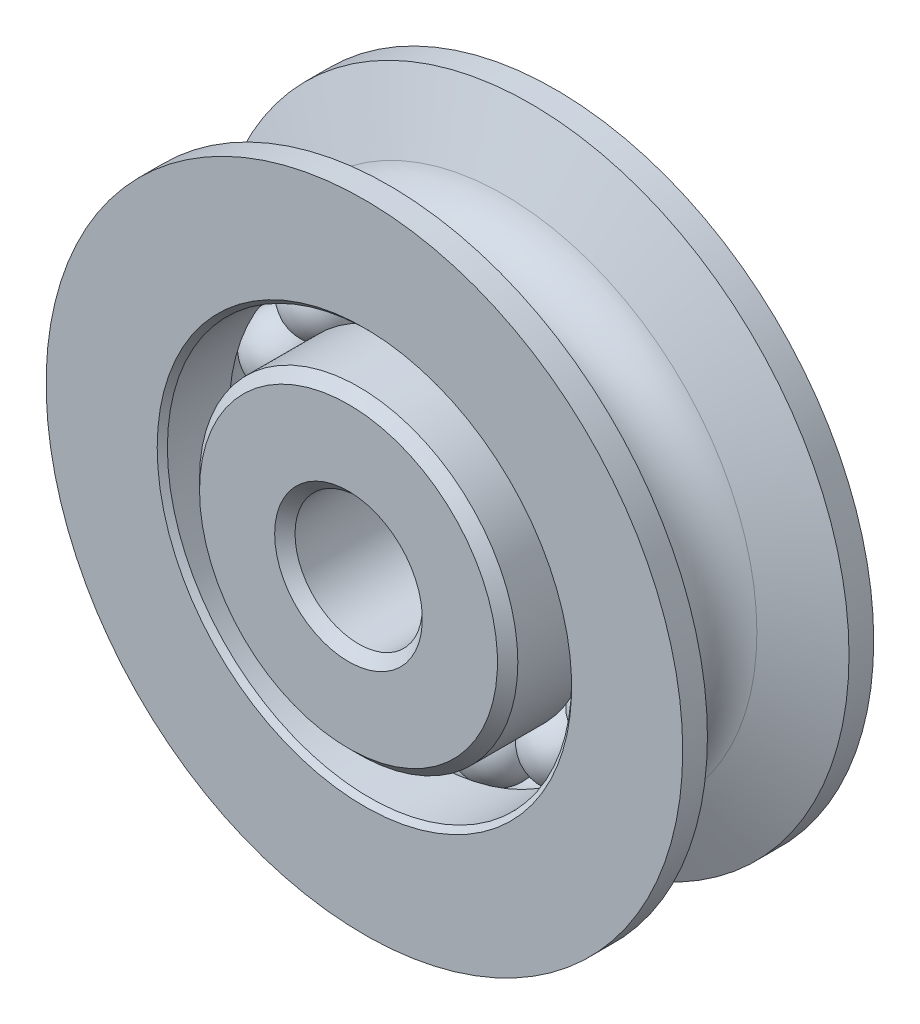
ISO-10303-21;
HEADER;
FILE_DESCRIPTION(('STEP AP214'),'2;1');
FILE_NAME('part.step','',(''),(''),'','','');
FILE_SCHEMA(('AUTOMOTIVE_DESIGN { 1 0 10303 214 1 1 1 1 }'));
ENDSEC;
DATA;
#1=APPLICATION_CONTEXT('core data for automotive mechanical design processes');
#2=APPLICATION_PROTOCOL_DEFINITION('international standard','automotive_design',2000,#1);
#3=PRODUCT_CONTEXT('',#1,'mechanical');
#4=PRODUCT('Part','Part','',(#3));
#5=PRODUCT_RELATED_PRODUCT_CATEGORY('part','',(#4));
#6=PRODUCT_DEFINITION_FORMATION('','',#4);
#7=PRODUCT_DEFINITION_CONTEXT('part definition',#1,'design');
#8=PRODUCT_DEFINITION('design','',#6,#7);
#9=PRODUCT_DEFINITION_SHAPE('','',#8);
#10=(LENGTH_UNIT() NAMED_UNIT(*) SI_UNIT(.MILLI.,.METRE.));
#11=(NAMED_UNIT(*) PLANE_ANGLE_UNIT() SI_UNIT($,.RADIAN.));
#12=(NAMED_UNIT(*) SI_UNIT($,.STERADIAN.) SOLID_ANGLE_UNIT());
#13=UNCERTAINTY_MEASURE_WITH_UNIT(LENGTH_MEASURE(1.E-05),#10,'distance_accuracy_value','');
#14=(GEOMETRIC_REPRESENTATION_CONTEXT(3) GLOBAL_UNCERTAINTY_ASSIGNED_CONTEXT((#13)) GLOBAL_UNIT_ASSIGNED_CONTEXT((#10,
#11,#12)) REPRESENTATION_CONTEXT('',''));
#15=CARTESIAN_POINT('',(0.,0.,0.));
#16=DIRECTION('',(0.,0.,1.));
#17=DIRECTION('',(1.,0.,0.));
#18=AXIS2_PLACEMENT_3D('',#15,#16,#17);
#19=CARTESIAN_POINT('',(3.66431583850997,8.23018812449334,0.));
#20=DIRECTION('',(0.406736643075789,0.913545457642606,0.));
#21=DIRECTION('',(0.,0.,-1.));
#22=AXIS2_PLACEMENT_3D('',#19,#20,#21);
#23=SPHERICAL_SURFACE('',#22,1.7859375);
#24=CARTESIAN_POINT('',(4.39072206200314,9.86172321525193,0.));
#25=VERTEX_POINT('',#24);
#26=VERTEX_LOOP('',#25);
#27=FACE_BOUND('',#26,.T.);
#28=ADVANCED_FACE('F35',(#27),#23,.T.);
#29=CLOSED_SHELL('',(#28));
#30=MANIFOLD_SOLID_BREP('B2',#29);
#31=CARTESIAN_POINT('',(6.69503817927736,6.02823945334993,0.));
#32=DIRECTION('',(0.743144825477386,0.669130606358867,0.));
#33=DIRECTION('',(0.,0.,-1.));
#34=AXIS2_PLACEMENT_3D('',#31,#32,#33);
#35=SPHERICAL_SURFACE('',#34,1.7859375);
#36=CARTESIAN_POINT('',(8.02224839102838,7.22326489564397,0.));
#37=VERTEX_POINT('',#36);
#38=VERTEX_LOOP('',#37);
#39=FACE_BOUND('',#38,.T.);
#40=ADVANCED_FACE('F53',(#39),#35,.T.);
#41=CLOSED_SHELL('',(#40));
#42=MANIFOLD_SOLID_BREP('B6',#41);
#43=CARTESIAN_POINT('',(8.56812759633528,2.78395341588614,0.));
#44=DIRECTION('',(0.95105651629515,0.309016994374957,0.));
#45=DIRECTION('',(0.,0.,-1.));
#46=AXIS2_PLACEMENT_3D('',#43,#44,#45);
#47=SPHERICAL_SURFACE('',#46,1.7859375);
#48=CARTESIAN_POINT('',(10.2666550934061,3.33583845427766,0.));
#49=VERTEX_POINT('',#48);
#50=VERTEX_LOOP('',#49);
#51=FACE_BOUND('',#50,.T.);
#52=ADVANCED_FACE('F71',(#51),#47,.T.);
#53=CLOSED_SHELL('',(#52));
#54=MANIFOLD_SOLID_BREP('B31',#53);
#55=CARTESIAN_POINT('',(8.95970991299125,-0.941703458607156,0.));
#56=DIRECTION('',(0.994521895368274,-0.104528463267644,0.));
#57=DIRECTION('',(0.,0.,-1.));
#58=AXIS2_PLACEMENT_3D('',#55,#56,#57);
#59=SPHERICAL_SURFACE('',#58,1.7859375);
#60=CARTESIAN_POINT('',(10.7358638605005,-1.12838476097421,0.));
#61=VERTEX_POINT('',#60);
#62=VERTEX_LOOP('',#61);
#63=FACE_BOUND('',#62,.T.);
#64=ADVANCED_FACE('F89',(#63),#59,.T.);
#65=CLOSED_SHELL('',(#64));
#66=MANIFOLD_SOLID_BREP('B49',#65);
#67=CARTESIAN_POINT('',(7.80207698928179,-4.50453124999993,0.));
#68=DIRECTION('',(0.866025403784443,-0.499999999999992,0.));
#69=DIRECTION('',(0.,0.,-1.));
#70=AXIS2_PLACEMENT_3D('',#67,#68,#69);
#71=SPHERICAL_SURFACE('',#70,1.7859375);
#72=CARTESIAN_POINT('',(9.34874423385306,-5.39749999999991,0.));
#73=VERTEX_POINT('',#72);
#74=VERTEX_LOOP('',#73);
#75=FACE_BOUND('',#74,.T.);
#76=ADVANCED_FACE('F107',(#75),#71,.T.);
#77=CLOSED_SHELL('',(#76));
#78=MANIFOLD_SOLID_BREP('B67',#77);
#79=CARTESIAN_POINT('',(5.29539407448122,-7.28848466588601,0.));
#80=DIRECTION('',(0.58778525229248,-0.809016994374943,0.));
#81=DIRECTION('',(0.,0.,-1.));
#82=AXIS2_PLACEMENT_3D('',#79,#80,#81);
#83=SPHERICAL_SURFACE('',#82,1.7859375);
#84=CARTESIAN_POINT('',(6.34514179849732,-8.7333384542775,0.));
#85=VERTEX_POINT('',#84);
#86=VERTEX_LOOP('',#85);
#87=FACE_BOUND('',#86,.T.);
#88=ADVANCED_FACE('F125',(#87),#83,.T.);
#89=CLOSED_SHELL('',(#88));
#90=MANIFOLD_SOLID_BREP('B85',#89);
#91=CARTESIAN_POINT('',(1.87308941705793,-8.81219286923589,0.));
#92=DIRECTION('',(0.207911690817766,-0.978147600733804,0.));
#93=DIRECTION('',(0.,0.,-1.));
#94=AXIS2_PLACEMENT_3D('',#91,#92,#93);
#95=SPHERICAL_SURFACE('',#94,1.7859375);
#96=CARTESIAN_POINT('',(2.24440670237779,-10.5591033499214,0.));
#97=VERTEX_POINT('',#96);
#98=VERTEX_LOOP('',#97);
#99=FACE_BOUND('',#98,.T.);
#100=ADVANCED_FACE('F143',(#99),#95,.T.);
#101=CLOSED_SHELL('',(#100));
#102=MANIFOLD_SOLID_BREP('B103',#101);
#103=CARTESIAN_POINT('',(-1.87308941705781,-8.81219286923591,0.));
#104=DIRECTION('',(-0.207911690817753,-0.978147600733807,0.));
#105=DIRECTION('',(0.,0.,-1.));
#106=AXIS2_PLACEMENT_3D('',#103,#104,#105);
#107=SPHERICAL_SURFACE('',#106,1.7859375);
#108=CARTESIAN_POINT('',(-2.24440670237765,-10.5591033499214,0.));
#109=VERTEX_POINT('',#108);
#110=VERTEX_LOOP('',#109);
#111=FACE_BOUND('',#110,.T.);
#112=ADVANCED_FACE('F161',(#111),#107,.T.);
#113=CLOSED_SHELL('',(#112));
#114=MANIFOLD_SOLID_BREP('B121',#113);
#115=CARTESIAN_POINT('',(-5.29539407448112,-7.28848466588608,0.));
#116=DIRECTION('',(-0.587785252292469,-0.80901699437495,0.));
#117=DIRECTION('',(0.,0.,-1.));
#118=AXIS2_PLACEMENT_3D('',#115,#116,#117);
#119=SPHERICAL_SURFACE('',#118,1.7859375);
#120=CARTESIAN_POINT('',(-6.3451417984972,-8.73333845427759,0.));
#121=VERTEX_POINT('',#120);
#122=VERTEX_LOOP('',#121);
#123=FACE_BOUND('',#122,.T.);
#124=ADVANCED_FACE('F179',(#123),#119,.T.);
#125=CLOSED_SHELL('',(#124));
#126=MANIFOLD_SOLID_BREP('B139',#125);
#127=CARTESIAN_POINT('',(-7.80207698928172,-4.50453125000004,0.));
#128=DIRECTION('',(-0.866025403784436,-0.500000000000004,0.));
#129=DIRECTION('',(0.,0.,-1.));
#130=AXIS2_PLACEMENT_3D('',#127,#128,#129);
#131=SPHERICAL_SURFACE('',#130,1.7859375);
#132=CARTESIAN_POINT('',(-9.34874423385299,-5.39750000000004,0.));
#133=VERTEX_POINT('',#132);
#134=VERTEX_LOOP('',#133);
#135=FACE_BOUND('',#134,.T.);
#136=ADVANCED_FACE('F197',(#135),#131,.T.);
#137=CLOSED_SHELL('',(#136));
#138=MANIFOLD_SOLID_BREP('B157',#137);
#139=CARTESIAN_POINT('',(-8.95970991299123,-0.941703458607277,0.));
#140=DIRECTION('',(-0.994521895368273,-0.104528463267657,0.));
#141=DIRECTION('',(0.,0.,-1.));
#142=AXIS2_PLACEMENT_3D('',#139,#140,#141);
#143=SPHERICAL_SURFACE('',#142,1.7859375);
#144=CARTESIAN_POINT('',(-10.7358638605005,-1.12838476097436,0.));
#145=VERTEX_POINT('',#144);
#146=VERTEX_LOOP('',#145);
#147=FACE_BOUND('',#146,.T.);
#148=ADVANCED_FACE('F215',(#147),#143,.T.);
#149=CLOSED_SHELL('',(#148));
#150=MANIFOLD_SOLID_BREP('B175',#149);
#151=CARTESIAN_POINT('',(-8.56812759633531,2.78395341588603,0.));
#152=DIRECTION('',(-0.951056516295154,0.309016994374945,0.));
#153=DIRECTION('',(0.,0.,-1.));
#154=AXIS2_PLACEMENT_3D('',#151,#152,#153);
#155=SPHERICAL_SURFACE('',#154,1.7859375);
#156=CARTESIAN_POINT('',(-10.2666550934062,3.33583845427753,0.));
#157=VERTEX_POINT('',#156);
#158=VERTEX_LOOP('',#157);
#159=FACE_BOUND('',#158,.T.);
#160=ADVANCED_FACE('F233',(#159),#155,.T.);
#161=CLOSED_SHELL('',(#160));
#162=MANIFOLD_SOLID_BREP('B193',#161);
#163=CARTESIAN_POINT('',(-6.69503817927745,6.02823945334984,0.));
#164=DIRECTION('',(-0.743144825477395,0.669130606358857,0.));
#165=DIRECTION('',(0.,0.,-1.));
#166=AXIS2_PLACEMENT_3D('',#163,#164,#165);
#167=SPHERICAL_SURFACE('',#166,1.7859375);
#168=CARTESIAN_POINT('',(-8.02224839102848,7.22326489564386,0.));
#169=VERTEX_POINT('',#168);
#170=VERTEX_LOOP('',#169);
#171=FACE_BOUND('',#170,.T.);
#172=ADVANCED_FACE('F251',(#171),#167,.T.);
#173=CLOSED_SHELL('',(#172));
#174=MANIFOLD_SOLID_BREP('B211',#173);
#175=CARTESIAN_POINT('',(-3.66431583851008,8.23018812449329,0.));
#176=DIRECTION('',(-0.406736643075801,0.913545457642601,0.));
#177=DIRECTION('',(0.,0.,-1.));
#178=AXIS2_PLACEMENT_3D('',#175,#176,#177);
#179=SPHERICAL_SURFACE('',#178,1.7859375);
#180=CARTESIAN_POINT('',(-4.39072206200327,9.86172321525187,0.));
#181=VERTEX_POINT('',#180);
#182=VERTEX_LOOP('',#181);
#183=FACE_BOUND('',#182,.T.);
#184=ADVANCED_FACE('F269',(#183),#179,.T.);
#185=CLOSED_SHELL('',(#184));
#186=MANIFOLD_SOLID_BREP('B229',#185);
#187=CARTESIAN_POINT('',(0.,9.0090625,0.));
#188=DIRECTION('',(0.,1.,0.));
#189=DIRECTION('',(0.,0.,-1.));
#190=AXIS2_PLACEMENT_3D('',#187,#188,#189);
#191=SPHERICAL_SURFACE('',#190,1.7859375);
#192=CARTESIAN_POINT('',(0.,10.795,0.));
#193=VERTEX_POINT('',#192);
#194=VERTEX_LOOP('',#193);
#195=FACE_BOUND('',#194,.T.);
#196=ADVANCED_FACE('F289',(#195),#191,.T.);
#197=CLOSED_SHELL('',(#196));
#198=MANIFOLD_SOLID_BREP('B247',#197);
#199=CARTESIAN_POINT('',(0.,7.9375,5.55625));
#200=DIRECTION('',(0.,0.,-1.));
#201=DIRECTION('',(-1.,0.,0.));
#202=AXIS2_PLACEMENT_3D('',#199,#200,#201);
#203=PLANE('',#202);
#204=CARTESIAN_POINT('',(0.,0.,5.55625));
#205=DIRECTION('',(0.,0.,-1.));
#206=DIRECTION('',(-1.,0.,0.));
#207=AXIS2_PLACEMENT_3D('',#204,#205,#206);
#208=CIRCLE('',#207,7.4295);
#209=CARTESIAN_POINT('',(-7.4295,0.,5.55625));
#210=VERTEX_POINT('',#209);
#211=EDGE_CURVE('E315',#210,#210,#208,.F.);
#212=ORIENTED_EDGE('',*,*,#211,.T.);
#213=EDGE_LOOP('',(#212));
#214=FACE_BOUND('',#213,.T.);
#215=CARTESIAN_POINT('',(0.,0.,5.55625));
#216=DIRECTION('',(0.,0.,-1.));
#217=DIRECTION('',(-1.,0.,0.));
#218=AXIS2_PLACEMENT_3D('',#215,#216,#217);
#219=CIRCLE('',#218,3.683);
#220=CARTESIAN_POINT('',(-3.683,0.,5.55625));
#221=VERTEX_POINT('',#220);
#222=EDGE_CURVE('E319',#221,#221,#219,.T.);
#223=ORIENTED_EDGE('',*,*,#222,.T.);
#224=EDGE_LOOP('',(#223));
#225=FACE_BOUND('',#224,.T.);
#226=ADVANCED_FACE('F308',(#214,#225),#203,.F.);
#227=CARTESIAN_POINT('',(0.,0.,5.55625));
#228=DIRECTION('',(0.,0.,1.));
#229=DIRECTION('',(1.,0.,0.));
#230=AXIS2_PLACEMENT_3D('',#227,#228,#229);
#231=CYLINDRICAL_SURFACE('',#230,3.175);
#232=CARTESIAN_POINT('',(0.,0.,-5.04825));
#233=DIRECTION('',(0.,0.,1.));
#234=DIRECTION('',(1.,0.,0.));
#235=AXIS2_PLACEMENT_3D('',#232,#233,#234);
#236=CIRCLE('',#235,3.175);
#237=CARTESIAN_POINT('',(3.175,0.,-5.04825));
#238=VERTEX_POINT('',#237);
#239=EDGE_CURVE('E328',#238,#238,#236,.F.);
#240=ORIENTED_EDGE('',*,*,#239,.T.);
#241=EDGE_LOOP('',(#240));
#242=FACE_BOUND('',#241,.T.);
#243=CARTESIAN_POINT('',(0.,0.,5.04825));
#244=DIRECTION('',(0.,0.,-1.));
#245=DIRECTION('',(-1.,0.,0.));
#246=AXIS2_PLACEMENT_3D('',#243,#244,#245);
#247=CIRCLE('',#246,3.175);
#248=CARTESIAN_POINT('',(-3.175,0.,5.04825));
#249=VERTEX_POINT('',#248);
#250=EDGE_CURVE('E331',#249,#249,#247,.F.);
#251=ORIENTED_EDGE('',*,*,#250,.T.);
#252=EDGE_LOOP('',(#251));
#253=FACE_BOUND('',#252,.T.);
#254=ADVANCED_FACE('F363',(#242,#253),#231,.F.);
#255=CARTESIAN_POINT('',(0.,7.9375,-5.55625));
#256=DIRECTION('',(0.,0.,1.));
#257=DIRECTION('',(1.,0.,0.));
#258=AXIS2_PLACEMENT_3D('',#255,#256,#257);
#259=PLANE('',#258);
#260=CARTESIAN_POINT('',(0.,0.,-5.55625));
#261=DIRECTION('',(0.,0.,1.));
#262=DIRECTION('',(1.,0.,0.));
#263=AXIS2_PLACEMENT_3D('',#260,#261,#262);
#264=CIRCLE('',#263,3.683);
#265=CARTESIAN_POINT('',(3.683,0.,-5.55625));
#266=VERTEX_POINT('',#265);
#267=EDGE_CURVE('E334',#266,#266,#264,.T.);
#268=ORIENTED_EDGE('',*,*,#267,.T.);
#269=EDGE_LOOP('',(#268));
#270=FACE_BOUND('',#269,.T.);
#271=CARTESIAN_POINT('',(0.,0.,-5.55625));
#272=DIRECTION('',(0.,0.,1.));
#273=DIRECTION('',(1.,0.,0.));
#274=AXIS2_PLACEMENT_3D('',#271,#272,#273);
#275=CIRCLE('',#274,7.4295);
#276=CARTESIAN_POINT('',(7.4295,0.,-5.55625));
#277=VERTEX_POINT('',#276);
#278=EDGE_CURVE('E337',#277,#277,#275,.F.);
#279=ORIENTED_EDGE('',*,*,#278,.T.);
#280=EDGE_LOOP('',(#279));
#281=FACE_BOUND('',#280,.T.);
#282=ADVANCED_FACE('F357',(#270,#281),#259,.F.);
#283=CARTESIAN_POINT('',(0.,0.,5.55625));
#284=DIRECTION('',(0.,0.,1.));
#285=DIRECTION('',(1.,0.,0.));
#286=AXIS2_PLACEMENT_3D('',#283,#284,#285);
#287=CYLINDRICAL_SURFACE('',#286,7.9375);
#288=CARTESIAN_POINT('',(0.,0.,-5.04825));
#289=DIRECTION('',(0.,0.,1.));
#290=DIRECTION('',(1.,0.,0.));
#291=AXIS2_PLACEMENT_3D('',#288,#289,#290);
#292=CIRCLE('',#291,7.9375);
#293=CARTESIAN_POINT('',(7.9375,0.,-5.04825));
#294=VERTEX_POINT('',#293);
#295=EDGE_CURVE('E323',#294,#294,#292,.T.);
#296=ORIENTED_EDGE('',*,*,#295,.T.);
#297=EDGE_LOOP('',(#296));
#298=FACE_BOUND('',#297,.T.);
#299=CARTESIAN_POINT('',(0.,0.,-1.42875));
#300=DIRECTION('',(0.,0.,1.));
#301=DIRECTION('',(1.,0.,0.));
#302=AXIS2_PLACEMENT_3D('',#299,#300,#301);
#303=CIRCLE('',#302,7.9375);
#304=CARTESIAN_POINT('',(7.9375,0.,-1.42875));
#305=VERTEX_POINT('',#304);
#306=EDGE_CURVE('E340',#305,#305,#303,.T.);
#307=ORIENTED_EDGE('',*,*,#306,.F.);
#308=EDGE_LOOP('',(#307));
#309=FACE_BOUND('',#308,.T.);
#310=ADVANCED_FACE('F352',(#298,#309),#287,.T.);
#311=CARTESIAN_POINT('',(0.,0.,0.));
#312=DIRECTION('',(0.,0.,1.));
#313=DIRECTION('',(1.,0.,0.));
#314=AXIS2_PLACEMENT_3D('',#311,#312,#313);
#315=TOROIDAL_SURFACE('',#314,9.0090625,1.7859375);
#316=CARTESIAN_POINT('',(0.,0.,1.42875));
#317=DIRECTION('',(0.,0.,1.));
#318=DIRECTION('',(1.,0.,0.));
#319=AXIS2_PLACEMENT_3D('',#316,#317,#318);
#320=CIRCLE('',#319,7.9375);
#321=CARTESIAN_POINT('',(7.9375,0.,1.42875));
#322=VERTEX_POINT('',#321);
#323=EDGE_CURVE('E343',#322,#322,#320,.T.);
#324=ORIENTED_EDGE('',*,*,#323,.F.);
#325=EDGE_LOOP('',(#324));
#326=FACE_BOUND('',#325,.T.);
#327=ORIENTED_EDGE('',*,*,#306,.T.);
#328=EDGE_LOOP('',(#327));
#329=FACE_BOUND('',#328,.T.);
#330=ADVANCED_FACE('F349',(#326,#329),#315,.F.);
#331=CARTESIAN_POINT('',(0.,0.,5.55625));
#332=DIRECTION('',(0.,0.,1.));
#333=DIRECTION('',(1.,0.,0.));
#334=AXIS2_PLACEMENT_3D('',#331,#332,#333);
#335=CYLINDRICAL_SURFACE('',#334,7.9375);
#336=CARTESIAN_POINT('',(0.,0.,5.04825));
#337=DIRECTION('',(0.,0.,-1.));
#338=DIRECTION('',(-1.,0.,0.));
#339=AXIS2_PLACEMENT_3D('',#336,#337,#338);
#340=CIRCLE('',#339,7.9375);
#341=CARTESIAN_POINT('',(-7.9375,0.,5.04825));
#342=VERTEX_POINT('',#341);
#343=EDGE_CURVE('E288',#342,#342,#340,.T.);
#344=ORIENTED_EDGE('',*,*,#343,.T.);
#345=EDGE_LOOP('',(#344));
#346=FACE_BOUND('',#345,.T.);
#347=ORIENTED_EDGE('',*,*,#323,.T.);
#348=EDGE_LOOP('',(#347));
#349=FACE_BOUND('',#348,.T.);
#350=ADVANCED_FACE('F347',(#346,#349),#335,.T.);
#351=CARTESIAN_POINT('',(0.,0.,-5.55625));
#352=DIRECTION('',(0.,0.,-1.));
#353=DIRECTION('',(-1.,0.,0.));
#354=AXIS2_PLACEMENT_3D('',#351,#352,#353);
#355=CONICAL_SURFACE('',#354,3.683,0.785398163397446);
#356=ORIENTED_EDGE('',*,*,#239,.F.);
#357=EDGE_LOOP('',(#356));
#358=FACE_BOUND('',#357,.T.);
#359=ORIENTED_EDGE('',*,*,#267,.F.);
#360=EDGE_LOOP('',(#359));
#361=FACE_BOUND('',#360,.T.);
#362=ADVANCED_FACE('F375',(#358,#361),#355,.F.);
#363=CARTESIAN_POINT('',(0.,0.,-5.04825));
#364=DIRECTION('',(0.,0.,1.));
#365=DIRECTION('',(1.,0.,0.));
#366=AXIS2_PLACEMENT_3D('',#363,#364,#365);
#367=CONICAL_SURFACE('',#366,7.9375,0.785398163397448);
#368=ORIENTED_EDGE('',*,*,#278,.F.);
#369=EDGE_LOOP('',(#368));
#370=FACE_BOUND('',#369,.T.);
#371=ORIENTED_EDGE('',*,*,#295,.F.);
#372=EDGE_LOOP('',(#371));
#373=FACE_BOUND('',#372,.T.);
#374=ADVANCED_FACE('F378',(#370,#373),#367,.T.);
#375=CARTESIAN_POINT('',(0.,0.,5.55625));
#376=DIRECTION('',(0.,0.,-1.));
#377=DIRECTION('',(-1.,0.,0.));
#378=AXIS2_PLACEMENT_3D('',#375,#376,#377);
#379=CONICAL_SURFACE('',#378,7.4295,0.785398163397448);
#380=ORIENTED_EDGE('',*,*,#343,.F.);
#381=EDGE_LOOP('',(#380));
#382=FACE_BOUND('',#381,.T.);
#383=ORIENTED_EDGE('',*,*,#211,.F.);
#384=EDGE_LOOP('',(#383));
#385=FACE_BOUND('',#384,.T.);
#386=ADVANCED_FACE('F381',(#382,#385),#379,.T.);
#387=CARTESIAN_POINT('',(0.,0.,5.04825));
#388=DIRECTION('',(0.,0.,1.));
#389=DIRECTION('',(1.,0.,0.));
#390=AXIS2_PLACEMENT_3D('',#387,#388,#389);
#391=CONICAL_SURFACE('',#390,3.175,0.785398163397448);
#392=ORIENTED_EDGE('',*,*,#222,.F.);
#393=EDGE_LOOP('',(#392));
#394=FACE_BOUND('',#393,.T.);
#395=ORIENTED_EDGE('',*,*,#250,.F.);
#396=EDGE_LOOP('',(#395));
#397=FACE_BOUND('',#396,.T.);
#398=ADVANCED_FACE('F310',(#394,#397),#391,.F.);
#399=CLOSED_SHELL('',(#226,#254,#282,#310,#330,#350,#362,#374,#386,#398));
#400=MANIFOLD_SOLID_BREP('B265',#399);
#401=CARTESIAN_POINT('',(0.,0.,0.));
#402=DIRECTION('',(0.,0.,1.));
#403=DIRECTION('',(1.,0.,0.));
#404=AXIS2_PLACEMENT_3D('',#401,#402,#403);
#405=TOROIDAL_SURFACE('',#404,13.49375,2.38125);
#406=CARTESIAN_POINT('',(0.,0.,2.20779758582892));
#407=DIRECTION('',(0.,0.,1.));
#408=DIRECTION('',(1.,0.,0.));
#409=AXIS2_PLACEMENT_3D('',#406,#407,#408);
#410=CIRCLE('',#409,12.6015721127443);
#411=CARTESIAN_POINT('',(12.6015721127443,0.,2.20779758582892));
#412=VERTEX_POINT('',#411);
#413=EDGE_CURVE('E479',#412,#412,#410,.T.);
#414=ORIENTED_EDGE('',*,*,#413,.F.);
#415=EDGE_LOOP('',(#414));
#416=FACE_BOUND('',#415,.T.);
#417=CARTESIAN_POINT('',(0.,0.,-2.20779758582892));
#418=DIRECTION('',(0.,0.,1.));
#419=DIRECTION('',(1.,0.,0.));
#420=AXIS2_PLACEMENT_3D('',#417,#418,#419);
#421=CIRCLE('',#420,12.6015721127443);
#422=CARTESIAN_POINT('',(12.6015721127443,0.,-2.20779758582892));
#423=VERTEX_POINT('',#422);
#424=EDGE_CURVE('E500',#423,#423,#421,.T.);
#425=ORIENTED_EDGE('',*,*,#424,.T.);
#426=EDGE_LOOP('',(#425));
#427=FACE_BOUND('',#426,.T.);
#428=ADVANCED_FACE('F459',(#416,#427),#405,.F.);
#429=CARTESIAN_POINT('',(0.,0.,2.20779758582892));
#430=DIRECTION('',(0.,0.,1.));
#431=DIRECTION('',(1.,0.,0.));
#432=AXIS2_PLACEMENT_3D('',#429,#430,#431);
#433=CONICAL_SURFACE('',#432,12.6015721127443,1.18675779166655);
#434=CARTESIAN_POINT('',(0.,0.,3.5306));
#435=DIRECTION('',(0.,0.,1.));
#436=DIRECTION('',(1.,0.,0.));
#437=AXIS2_PLACEMENT_3D('',#434,#435,#436);
#438=CIRCLE('',#437,15.875);
#439=CARTESIAN_POINT('',(15.875,0.,3.5306));
#440=VERTEX_POINT('',#439);
#441=EDGE_CURVE('E482',#440,#440,#438,.T.);
#442=ORIENTED_EDGE('',*,*,#441,.F.);
#443=EDGE_LOOP('',(#442));
#444=FACE_BOUND('',#443,.T.);
#445=ORIENTED_EDGE('',*,*,#413,.T.);
#446=EDGE_LOOP('',(#445));
#447=FACE_BOUND('',#446,.T.);
#448=ADVANCED_FACE('F530',(#444,#447),#433,.T.);
#449=CARTESIAN_POINT('',(0.,0.,5.55625));
#450=DIRECTION('',(0.,0.,1.));
#451=DIRECTION('',(1.,0.,0.));
#452=AXIS2_PLACEMENT_3D('',#449,#450,#451);
#453=CYLINDRICAL_SURFACE('',#452,15.875);
#454=CARTESIAN_POINT('',(0.,0.,4.7625));
#455=DIRECTION('',(0.,0.,1.));
#456=DIRECTION('',(1.,0.,0.));
#457=AXIS2_PLACEMENT_3D('',#454,#455,#456);
#458=CIRCLE('',#457,15.875);
#459=CARTESIAN_POINT('',(15.875,0.,4.7625));
#460=VERTEX_POINT('',#459);
#461=EDGE_CURVE('E485',#460,#460,#458,.T.);
#462=ORIENTED_EDGE('',*,*,#461,.F.);
#463=EDGE_LOOP('',(#462));
#464=FACE_BOUND('',#463,.T.);
#465=ORIENTED_EDGE('',*,*,#441,.T.);
#466=EDGE_LOOP('',(#465));
#467=FACE_BOUND('',#466,.T.);
#468=ADVANCED_FACE('F536',(#464,#467),#453,.T.);
#469=CARTESIAN_POINT('',(0.,10.080625,4.7625));
#470=DIRECTION('',(0.,0.,-1.));
#471=DIRECTION('',(-1.,0.,0.));
#472=AXIS2_PLACEMENT_3D('',#469,#470,#471);
#473=PLANE('',#472);
#474=CARTESIAN_POINT('',(0.,0.,4.7625));
#475=DIRECTION('',(0.,0.,-1.));
#476=DIRECTION('',(-1.,0.,0.));
#477=AXIS2_PLACEMENT_3D('',#474,#475,#476);
#478=CIRCLE('',#477,10.334625);
#479=CARTESIAN_POINT('',(-10.334625,0.,4.7625));
#480=VERTEX_POINT('',#479);
#481=EDGE_CURVE('E307',#480,#480,#478,.T.);
#482=ORIENTED_EDGE('',*,*,#481,.T.);
#483=EDGE_LOOP('',(#482));
#484=FACE_BOUND('',#483,.T.);
#485=ORIENTED_EDGE('',*,*,#461,.T.);
#486=EDGE_LOOP('',(#485));
#487=FACE_BOUND('',#486,.T.);
#488=ADVANCED_FACE('F560',(#484,#487),#473,.F.);
#489=CARTESIAN_POINT('',(0.,0.,5.55625));
#490=DIRECTION('',(0.,0.,1.));
#491=DIRECTION('',(1.,0.,0.));
#492=AXIS2_PLACEMENT_3D('',#489,#490,#491);
#493=CYLINDRICAL_SURFACE('',#492,10.080625);
#494=CARTESIAN_POINT('',(0.,0.,4.50849999999999));
#495=DIRECTION('',(0.,0.,-1.));
#496=DIRECTION('',(-1.,0.,0.));
#497=AXIS2_PLACEMENT_3D('',#494,#495,#496);
#498=CIRCLE('',#497,10.080625);
#499=CARTESIAN_POINT('',(-10.080625,0.,4.50849999999999));
#500=VERTEX_POINT('',#499);
#501=EDGE_CURVE('E466',#500,#500,#498,.F.);
#502=ORIENTED_EDGE('',*,*,#501,.T.);
#503=EDGE_LOOP('',(#502));
#504=FACE_BOUND('',#503,.T.);
#505=CARTESIAN_POINT('',(0.,0.,1.42875));
#506=DIRECTION('',(0.,0.,1.));
#507=DIRECTION('',(1.,0.,0.));
#508=AXIS2_PLACEMENT_3D('',#505,#506,#507);
#509=CIRCLE('',#508,10.080625);
#510=CARTESIAN_POINT('',(10.080625,0.,1.42875));
#511=VERTEX_POINT('',#510);
#512=EDGE_CURVE('E488',#511,#511,#509,.T.);
#513=ORIENTED_EDGE('',*,*,#512,.F.);
#514=EDGE_LOOP('',(#513));
#515=FACE_BOUND('',#514,.T.);
#516=ADVANCED_FACE('F555',(#504,#515),#493,.F.);
#517=CARTESIAN_POINT('',(0.,0.,0.));
#518=DIRECTION('',(0.,0.,1.));
#519=DIRECTION('',(1.,0.,0.));
#520=AXIS2_PLACEMENT_3D('',#517,#518,#519);
#521=TOROIDAL_SURFACE('',#520,9.0090625,1.7859375);
#522=CARTESIAN_POINT('',(0.,0.,-1.42875));
#523=DIRECTION('',(0.,0.,1.));
#524=DIRECTION('',(1.,0.,0.));
#525=AXIS2_PLACEMENT_3D('',#522,#523,#524);
#526=CIRCLE('',#525,10.080625);
#527=CARTESIAN_POINT('',(10.080625,0.,-1.42875));
#528=VERTEX_POINT('',#527);
#529=EDGE_CURVE('E491',#528,#528,#526,.T.);
#530=ORIENTED_EDGE('',*,*,#529,.F.);
#531=EDGE_LOOP('',(#530));
#532=FACE_BOUND('',#531,.T.);
#533=ORIENTED_EDGE('',*,*,#512,.T.);
#534=EDGE_LOOP('',(#533));
#535=FACE_BOUND('',#534,.T.);
#536=ADVANCED_FACE('F526',(#532,#535),#521,.F.);
#537=CARTESIAN_POINT('',(0.,0.,5.55625));
#538=DIRECTION('',(0.,0.,1.));
#539=DIRECTION('',(1.,0.,0.));
#540=AXIS2_PLACEMENT_3D('',#537,#538,#539);
#541=CYLINDRICAL_SURFACE('',#540,10.080625);
#542=CARTESIAN_POINT('',(0.,0.,-4.50849999999999));
#543=DIRECTION('',(0.,0.,1.));
#544=DIRECTION('',(1.,0.,0.));
#545=AXIS2_PLACEMENT_3D('',#542,#543,#544);
#546=CIRCLE('',#545,10.080625);
#547=CARTESIAN_POINT('',(10.080625,0.,-4.50849999999999));
#548=VERTEX_POINT('',#547);
#549=EDGE_CURVE('E470',#548,#548,#546,.F.);
#550=ORIENTED_EDGE('',*,*,#549,.T.);
#551=EDGE_LOOP('',(#550));
#552=FACE_BOUND('',#551,.T.);
#553=ORIENTED_EDGE('',*,*,#529,.T.);
#554=EDGE_LOOP('',(#553));
#555=FACE_BOUND('',#554,.T.);
#556=ADVANCED_FACE('F520',(#552,#555),#541,.F.);
#557=CARTESIAN_POINT('',(0.,15.875,-4.7625));
#558=DIRECTION('',(0.,0.,1.));
#559=DIRECTION('',(1.,0.,0.));
#560=AXIS2_PLACEMENT_3D('',#557,#558,#559);
#561=PLANE('',#560);
#562=CARTESIAN_POINT('',(0.,0.,-4.7625));
#563=DIRECTION('',(0.,0.,1.));
#564=DIRECTION('',(1.,0.,0.));
#565=AXIS2_PLACEMENT_3D('',#562,#563,#564);
#566=CIRCLE('',#565,10.334625);
#567=CARTESIAN_POINT('',(10.334625,0.,-4.7625));
#568=VERTEX_POINT('',#567);
#569=EDGE_CURVE('E474',#568,#568,#566,.T.);
#570=ORIENTED_EDGE('',*,*,#569,.T.);
#571=EDGE_LOOP('',(#570));
#572=FACE_BOUND('',#571,.T.);
#573=CARTESIAN_POINT('',(0.,0.,-4.7625));
#574=DIRECTION('',(0.,0.,1.));
#575=DIRECTION('',(1.,0.,0.));
#576=AXIS2_PLACEMENT_3D('',#573,#574,#575);
#577=CIRCLE('',#576,15.875);
#578=CARTESIAN_POINT('',(15.875,0.,-4.7625));
#579=VERTEX_POINT('',#578);
#580=EDGE_CURVE('E494',#579,#579,#577,.T.);
#581=ORIENTED_EDGE('',*,*,#580,.F.);
#582=EDGE_LOOP('',(#581));
#583=FACE_BOUND('',#582,.T.);
#584=ADVANCED_FACE('F515',(#572,#583),#561,.F.);
#585=CARTESIAN_POINT('',(0.,0.,5.55625));
#586=DIRECTION('',(0.,0.,1.));
#587=DIRECTION('',(1.,0.,0.));
#588=AXIS2_PLACEMENT_3D('',#585,#586,#587);
#589=CYLINDRICAL_SURFACE('',#588,15.875);
#590=CARTESIAN_POINT('',(0.,0.,-3.5306));
#591=DIRECTION('',(0.,0.,1.));
#592=DIRECTION('',(1.,0.,0.));
#593=AXIS2_PLACEMENT_3D('',#590,#591,#592);
#594=CIRCLE('',#593,15.875);
#595=CARTESIAN_POINT('',(15.875,0.,-3.5306));
#596=VERTEX_POINT('',#595);
#597=EDGE_CURVE('E497',#596,#596,#594,.T.);
#598=ORIENTED_EDGE('',*,*,#597,.F.);
#599=EDGE_LOOP('',(#598));
#600=FACE_BOUND('',#599,.T.);
#601=ORIENTED_EDGE('',*,*,#580,.T.);
#602=EDGE_LOOP('',(#601));
#603=FACE_BOUND('',#602,.T.);
#604=ADVANCED_FACE('F509',(#600,#603),#589,.T.);
#605=CARTESIAN_POINT('',(0.,0.,-3.5306));
#606=DIRECTION('',(0.,0.,-1.));
#607=DIRECTION('',(-1.,0.,0.));
#608=AXIS2_PLACEMENT_3D('',#605,#606,#607);
#609=CONICAL_SURFACE('',#608,15.875,1.18675779166655);
#610=ORIENTED_EDGE('',*,*,#424,.F.);
#611=EDGE_LOOP('',(#610));
#612=FACE_BOUND('',#611,.T.);
#613=ORIENTED_EDGE('',*,*,#597,.T.);
#614=EDGE_LOOP('',(#613));
#615=FACE_BOUND('',#614,.T.);
#616=ADVANCED_FACE('F505',(#612,#615),#609,.T.);
#617=CARTESIAN_POINT('',(0.,0.,-4.7625));
#618=DIRECTION('',(0.,0.,-1.));
#619=DIRECTION('',(-1.,0.,0.));
#620=AXIS2_PLACEMENT_3D('',#617,#618,#619);
#621=CONICAL_SURFACE('',#620,10.334625,0.785398163397442);
#622=ORIENTED_EDGE('',*,*,#549,.F.);
#623=EDGE_LOOP('',(#622));
#624=FACE_BOUND('',#623,.T.);
#625=ORIENTED_EDGE('',*,*,#569,.F.);
#626=EDGE_LOOP('',(#625));
#627=FACE_BOUND('',#626,.T.);
#628=ADVANCED_FACE('F508',(#624,#627),#621,.F.);
#629=CARTESIAN_POINT('',(0.,0.,4.50849999999999));
#630=DIRECTION('',(0.,0.,1.));
#631=DIRECTION('',(1.,0.,0.));
#632=AXIS2_PLACEMENT_3D('',#629,#630,#631);
#633=CONICAL_SURFACE('',#632,10.080625,0.785398163397462);
#634=ORIENTED_EDGE('',*,*,#481,.F.);
#635=EDGE_LOOP('',(#634));
#636=FACE_BOUND('',#635,.T.);
#637=ORIENTED_EDGE('',*,*,#501,.F.);
#638=EDGE_LOOP('',(#637));
#639=FACE_BOUND('',#638,.T.);
#640=ADVANCED_FACE('F461',(#636,#639),#633,.F.);
#641=CLOSED_SHELL('',(#428,#448,#468,#488,#516,#536,#556,#584,#604,#616,#628,#640));
#642=MANIFOLD_SOLID_BREP('B283',#641);
#643=ADVANCED_BREP_SHAPE_REPRESENTATION('',(#18,#30,#42,#54,#66,#78,#90,#102,#114,#126,#138,
#150,#162,#174,#186,#198,#400,#642),#14);
#644=SHAPE_DEFINITION_REPRESENTATION(#9,#643);
ENDSEC;
END-ISO-10303-21;
